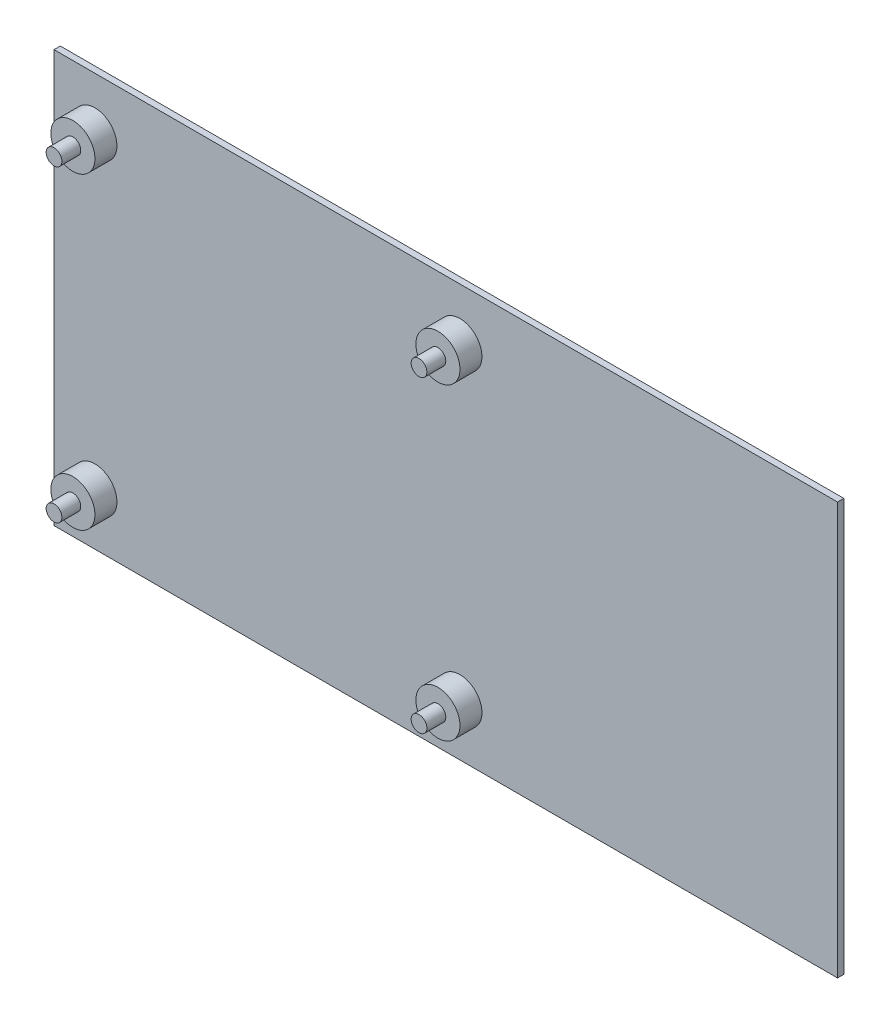
ISO-10303-21;
HEADER;
FILE_DESCRIPTION(('STEP AP214'),'2;1');
FILE_NAME('part.step','',(''),(''),'','','');
FILE_SCHEMA(('AUTOMOTIVE_DESIGN { 1 0 10303 214 1 1 1 1 }'));
ENDSEC;
DATA;
#1=APPLICATION_CONTEXT('core data for automotive mechanical design processes');
#2=APPLICATION_PROTOCOL_DEFINITION('international standard','automotive_design',2000,#1);
#3=PRODUCT_CONTEXT('',#1,'mechanical');
#4=PRODUCT('Part','Part','',(#3));
#5=PRODUCT_RELATED_PRODUCT_CATEGORY('part','',(#4));
#6=PRODUCT_DEFINITION_FORMATION('','',#4);
#7=PRODUCT_DEFINITION_CONTEXT('part definition',#1,'design');
#8=PRODUCT_DEFINITION('design','',#6,#7);
#9=PRODUCT_DEFINITION_SHAPE('','',#8);
#10=(LENGTH_UNIT() NAMED_UNIT(*) SI_UNIT(.MILLI.,.METRE.));
#11=(NAMED_UNIT(*) PLANE_ANGLE_UNIT() SI_UNIT($,.RADIAN.));
#12=(NAMED_UNIT(*) SI_UNIT($,.STERADIAN.) SOLID_ANGLE_UNIT());
#13=UNCERTAINTY_MEASURE_WITH_UNIT(LENGTH_MEASURE(1.E-05),#10,'distance_accuracy_value','');
#14=(GEOMETRIC_REPRESENTATION_CONTEXT(3) GLOBAL_UNCERTAINTY_ASSIGNED_CONTEXT((#13)) GLOBAL_UNIT_ASSIGNED_CONTEXT((#10,
#11,#12)) REPRESENTATION_CONTEXT('',''));
#15=CARTESIAN_POINT('',(0.,0.,0.));
#16=DIRECTION('',(0.,0.,1.));
#17=DIRECTION('',(1.,0.,0.));
#18=AXIS2_PLACEMENT_3D('',#15,#16,#17);
#19=CARTESIAN_POINT('',(-55.75,-24.5,4.5));
#20=DIRECTION('',(0.,0.,1.));
#21=DIRECTION('',(1.,0.,0.));
#22=AXIS2_PLACEMENT_3D('',#19,#20,#21);
#23=PLANE('',#22);
#24=CARTESIAN_POINT('',(-55.75,-24.5,4.5));
#25=DIRECTION('',(0.,0.,1.));
#26=DIRECTION('',(1.,0.,0.));
#27=AXIS2_PLACEMENT_3D('',#24,#25,#26);
#28=CIRCLE('',#27,3.5);
#29=CARTESIAN_POINT('',(-52.25,-24.5,4.5));
#30=VERTEX_POINT('',#29);
#31=EDGE_CURVE('E183',#30,#30,#28,.T.);
#32=ORIENTED_EDGE('',*,*,#31,.T.);
#33=EDGE_LOOP('',(#32));
#34=FACE_BOUND('',#33,.T.);
#35=CARTESIAN_POINT('',(-55.75,-24.5,4.5));
#36=DIRECTION('',(0.,0.,1.));
#37=DIRECTION('',(1.,0.,0.));
#38=AXIS2_PLACEMENT_3D('',#35,#36,#37);
#39=CIRCLE('',#38,1.25);
#40=CARTESIAN_POINT('',(-54.5,-24.5,4.5));
#41=VERTEX_POINT('',#40);
#42=EDGE_CURVE('E215',#41,#41,#39,.T.);
#43=ORIENTED_EDGE('',*,*,#42,.F.);
#44=EDGE_LOOP('',(#43));
#45=FACE_BOUND('',#44,.T.);
#46=ADVANCED_FACE('F32',(#34,#45),#23,.T.);
#47=CARTESIAN_POINT('',(2.25,-24.5,4.5));
#48=DIRECTION('',(0.,0.,1.));
#49=DIRECTION('',(1.,0.,0.));
#50=AXIS2_PLACEMENT_3D('',#47,#48,#49);
#51=PLANE('',#50);
#52=CARTESIAN_POINT('',(2.25,-24.5,4.5));
#53=DIRECTION('',(0.,0.,1.));
#54=DIRECTION('',(1.,0.,0.));
#55=AXIS2_PLACEMENT_3D('',#52,#53,#54);
#56=CIRCLE('',#55,3.5);
#57=CARTESIAN_POINT('',(5.75,-24.5,4.5));
#58=VERTEX_POINT('',#57);
#59=EDGE_CURVE('E191',#58,#58,#56,.T.);
#60=ORIENTED_EDGE('',*,*,#59,.T.);
#61=EDGE_LOOP('',(#60));
#62=FACE_BOUND('',#61,.T.);
#63=CARTESIAN_POINT('',(2.25,-24.5,4.5));
#64=DIRECTION('',(0.,0.,1.));
#65=DIRECTION('',(1.,0.,0.));
#66=AXIS2_PLACEMENT_3D('',#63,#64,#65);
#67=CIRCLE('',#66,1.25);
#68=CARTESIAN_POINT('',(3.5,-24.5,4.5));
#69=VERTEX_POINT('',#68);
#70=EDGE_CURVE('E209',#69,#69,#67,.T.);
#71=ORIENTED_EDGE('',*,*,#70,.F.);
#72=EDGE_LOOP('',(#71));
#73=FACE_BOUND('',#72,.T.);
#74=ADVANCED_FACE('F145',(#62,#73),#51,.T.);
#75=CARTESIAN_POINT('',(2.25,24.5,4.5));
#76=DIRECTION('',(0.,0.,1.));
#77=DIRECTION('',(1.,0.,0.));
#78=AXIS2_PLACEMENT_3D('',#75,#76,#77);
#79=PLANE('',#78);
#80=CARTESIAN_POINT('',(2.25,24.5,4.5));
#81=DIRECTION('',(0.,0.,1.));
#82=DIRECTION('',(1.,0.,0.));
#83=AXIS2_PLACEMENT_3D('',#80,#81,#82);
#84=CIRCLE('',#83,3.5);
#85=CARTESIAN_POINT('',(5.74999999999999,24.5,4.5));
#86=VERTEX_POINT('',#85);
#87=EDGE_CURVE('E194',#86,#86,#84,.T.);
#88=ORIENTED_EDGE('',*,*,#87,.T.);
#89=EDGE_LOOP('',(#88));
#90=FACE_BOUND('',#89,.T.);
#91=CARTESIAN_POINT('',(2.25,24.5,4.5));
#92=DIRECTION('',(0.,0.,1.));
#93=DIRECTION('',(1.,0.,0.));
#94=AXIS2_PLACEMENT_3D('',#91,#92,#93);
#95=CIRCLE('',#94,1.25);
#96=CARTESIAN_POINT('',(3.49999999999999,24.5,4.5));
#97=VERTEX_POINT('',#96);
#98=EDGE_CURVE('E186',#97,#97,#95,.T.);
#99=ORIENTED_EDGE('',*,*,#98,.F.);
#100=EDGE_LOOP('',(#99));
#101=FACE_BOUND('',#100,.T.);
#102=ADVANCED_FACE('F151',(#90,#101),#79,.T.);
#103=CARTESIAN_POINT('',(-55.75,24.5,4.5));
#104=DIRECTION('',(0.,0.,1.));
#105=DIRECTION('',(1.,0.,0.));
#106=AXIS2_PLACEMENT_3D('',#103,#104,#105);
#107=PLANE('',#106);
#108=CARTESIAN_POINT('',(-55.75,24.5,4.5));
#109=DIRECTION('',(0.,0.,1.));
#110=DIRECTION('',(1.,0.,0.));
#111=AXIS2_PLACEMENT_3D('',#108,#109,#110);
#112=CIRCLE('',#111,3.5);
#113=CARTESIAN_POINT('',(-52.25,24.5,4.5));
#114=VERTEX_POINT('',#113);
#115=EDGE_CURVE('E104',#114,#114,#112,.T.);
#116=ORIENTED_EDGE('',*,*,#115,.T.);
#117=EDGE_LOOP('',(#116));
#118=FACE_BOUND('',#117,.T.);
#119=CARTESIAN_POINT('',(-55.75,24.5,4.5));
#120=DIRECTION('',(0.,0.,1.));
#121=DIRECTION('',(1.,0.,0.));
#122=AXIS2_PLACEMENT_3D('',#119,#120,#121);
#123=CIRCLE('',#122,1.25);
#124=CARTESIAN_POINT('',(-54.5,24.5,4.5));
#125=VERTEX_POINT('',#124);
#126=EDGE_CURVE('E177',#125,#125,#123,.T.);
#127=ORIENTED_EDGE('',*,*,#126,.F.);
#128=EDGE_LOOP('',(#127));
#129=FACE_BOUND('',#128,.T.);
#130=ADVANCED_FACE('F123',(#118,#129),#107,.T.);
#131=CARTESIAN_POINT('',(0.,0.,1.));
#132=DIRECTION('',(0.,0.,-1.));
#133=DIRECTION('',(-1.,0.,0.));
#134=AXIS2_PLACEMENT_3D('',#131,#132,#133);
#135=PLANE('',#134);
#136=CARTESIAN_POINT('',(2.25,-24.5,1.));
#137=DIRECTION('',(0.,0.,-1.));
#138=DIRECTION('',(-1.,0.,0.));
#139=AXIS2_PLACEMENT_3D('',#136,#137,#138);
#140=CIRCLE('',#139,3.5);
#141=CARTESIAN_POINT('',(-1.25,-24.5,1.));
#142=VERTEX_POINT('',#141);
#143=EDGE_CURVE('E41',#142,#142,#140,.F.);
#144=ORIENTED_EDGE('',*,*,#143,.F.);
#145=EDGE_LOOP('',(#144));
#146=FACE_BOUND('',#145,.T.);
#147=CARTESIAN_POINT('',(-55.75,24.5,1.));
#148=DIRECTION('',(0.,0.,-1.));
#149=DIRECTION('',(-1.,0.,0.));
#150=AXIS2_PLACEMENT_3D('',#147,#148,#149);
#151=CIRCLE('',#150,3.5);
#152=CARTESIAN_POINT('',(-59.25,24.5,1.));
#153=VERTEX_POINT('',#152);
#154=EDGE_CURVE('E111',#153,#153,#151,.F.);
#155=ORIENTED_EDGE('',*,*,#154,.F.);
#156=EDGE_LOOP('',(#155));
#157=FACE_BOUND('',#156,.T.);
#158=DIRECTION('',(0.,-1.,0.));
#159=VECTOR('',#158,1.);
#160=CARTESIAN_POINT('',(-62.25,32.75,1.));
#161=LINE('',#160,#159);
#162=CARTESIAN_POINT('',(-62.25,32.75,1.));
#163=VERTEX_POINT('',#162);
#164=CARTESIAN_POINT('',(-62.25,-32.75,1.));
#165=VERTEX_POINT('',#164);
#166=EDGE_CURVE('E86',#163,#165,#161,.T.);
#167=ORIENTED_EDGE('',*,*,#166,.T.);
#168=DIRECTION('',(1.,0.,0.));
#169=VECTOR('',#168,1.);
#170=CARTESIAN_POINT('',(62.25,-32.75,1.));
#171=LINE('',#170,#169);
#172=CARTESIAN_POINT('',(62.25,-32.75,1.));
#173=VERTEX_POINT('',#172);
#174=EDGE_CURVE('E80',#165,#173,#171,.T.);
#175=ORIENTED_EDGE('',*,*,#174,.T.);
#176=DIRECTION('',(0.,1.,0.));
#177=VECTOR('',#176,1.);
#178=CARTESIAN_POINT('',(62.25,32.75,1.));
#179=LINE('',#178,#177);
#180=CARTESIAN_POINT('',(62.25,32.75,1.));
#181=VERTEX_POINT('',#180);
#182=EDGE_CURVE('E84',#173,#181,#179,.T.);
#183=ORIENTED_EDGE('',*,*,#182,.T.);
#184=DIRECTION('',(-1.,0.,0.));
#185=VECTOR('',#184,1.);
#186=CARTESIAN_POINT('',(62.25,32.75,1.));
#187=LINE('',#186,#185);
#188=EDGE_CURVE('E49',#181,#163,#187,.T.);
#189=ORIENTED_EDGE('',*,*,#188,.T.);
#190=EDGE_LOOP('',(#167,#175,#183,#189));
#191=FACE_BOUND('',#190,.T.);
#192=CARTESIAN_POINT('',(2.25,24.5,1.));
#193=DIRECTION('',(0.,0.,-1.));
#194=DIRECTION('',(-1.,0.,0.));
#195=AXIS2_PLACEMENT_3D('',#192,#193,#194);
#196=CIRCLE('',#195,3.5);
#197=CARTESIAN_POINT('',(-1.25,24.5,1.));
#198=VERTEX_POINT('',#197);
#199=EDGE_CURVE('E114',#198,#198,#196,.F.);
#200=ORIENTED_EDGE('',*,*,#199,.F.);
#201=EDGE_LOOP('',(#200));
#202=FACE_BOUND('',#201,.T.);
#203=CARTESIAN_POINT('',(-55.75,-24.5,1.));
#204=DIRECTION('',(0.,0.,-1.));
#205=DIRECTION('',(-1.,0.,0.));
#206=AXIS2_PLACEMENT_3D('',#203,#204,#205);
#207=CIRCLE('',#206,3.5);
#208=CARTESIAN_POINT('',(-59.25,-24.5,1.));
#209=VERTEX_POINT('',#208);
#210=EDGE_CURVE('E11',#209,#209,#207,.F.);
#211=ORIENTED_EDGE('',*,*,#210,.F.);
#212=EDGE_LOOP('',(#211));
#213=FACE_BOUND('',#212,.T.);
#214=ADVANCED_FACE('F81',(#146,#157,#191,#202,#213),#135,.F.);
#215=CARTESIAN_POINT('',(-62.25,32.75,1.));
#216=DIRECTION('',(1.,0.,0.));
#217=DIRECTION('',(0.,1.,0.));
#218=AXIS2_PLACEMENT_3D('',#215,#216,#217);
#219=PLANE('',#218);
#220=DIRECTION('',(0.,-1.,0.));
#221=VECTOR('',#220,1.);
#222=CARTESIAN_POINT('',(-62.25,32.75,0.));
#223=LINE('',#222,#221);
#224=CARTESIAN_POINT('',(-62.25,32.75,0.));
#225=VERTEX_POINT('',#224);
#226=CARTESIAN_POINT('',(-62.25,-32.75,0.));
#227=VERTEX_POINT('',#226);
#228=EDGE_CURVE('E101',#225,#227,#223,.T.);
#229=ORIENTED_EDGE('',*,*,#228,.T.);
#230=DIRECTION('',(0.,0.,-1.));
#231=VECTOR('',#230,1.);
#232=CARTESIAN_POINT('',(-62.25,-32.75,1.));
#233=LINE('',#232,#231);
#234=EDGE_CURVE('E92',#165,#227,#233,.T.);
#235=ORIENTED_EDGE('',*,*,#234,.F.);
#236=ORIENTED_EDGE('',*,*,#166,.F.);
#237=DIRECTION('',(0.,0.,-1.));
#238=VECTOR('',#237,1.);
#239=CARTESIAN_POINT('',(-62.25,32.75,1.));
#240=LINE('',#239,#238);
#241=EDGE_CURVE('E97',#163,#225,#240,.T.);
#242=ORIENTED_EDGE('',*,*,#241,.T.);
#243=EDGE_LOOP('',(#229,#235,#236,#242));
#244=FACE_BOUND('',#243,.T.);
#245=ADVANCED_FACE('F34',(#244),#219,.F.);
#246=CARTESIAN_POINT('',(62.25,-32.75,1.));
#247=DIRECTION('',(0.,1.,0.));
#248=DIRECTION('',(-1.,0.,0.));
#249=AXIS2_PLACEMENT_3D('',#246,#247,#248);
#250=PLANE('',#249);
#251=DIRECTION('',(1.,0.,0.));
#252=VECTOR('',#251,1.);
#253=CARTESIAN_POINT('',(62.25,-32.75,0.));
#254=LINE('',#253,#252);
#255=CARTESIAN_POINT('',(62.25,-32.75,0.));
#256=VERTEX_POINT('',#255);
#257=EDGE_CURVE('E91',#227,#256,#254,.T.);
#258=ORIENTED_EDGE('',*,*,#257,.T.);
#259=DIRECTION('',(0.,0.,-1.));
#260=VECTOR('',#259,1.);
#261=CARTESIAN_POINT('',(62.25,-32.75,1.));
#262=LINE('',#261,#260);
#263=EDGE_CURVE('E89',#173,#256,#262,.T.);
#264=ORIENTED_EDGE('',*,*,#263,.F.);
#265=ORIENTED_EDGE('',*,*,#174,.F.);
#266=ORIENTED_EDGE('',*,*,#234,.T.);
#267=EDGE_LOOP('',(#258,#264,#265,#266));
#268=FACE_BOUND('',#267,.T.);
#269=ADVANCED_FACE('F90',(#268),#250,.F.);
#270=CARTESIAN_POINT('',(62.25,32.75,1.));
#271=DIRECTION('',(-1.,0.,0.));
#272=DIRECTION('',(0.,-1.,0.));
#273=AXIS2_PLACEMENT_3D('',#270,#271,#272);
#274=PLANE('',#273);
#275=DIRECTION('',(0.,1.,0.));
#276=VECTOR('',#275,1.);
#277=CARTESIAN_POINT('',(62.25,32.75,0.));
#278=LINE('',#277,#276);
#279=CARTESIAN_POINT('',(62.25,32.75,0.));
#280=VERTEX_POINT('',#279);
#281=EDGE_CURVE('E66',#256,#280,#278,.T.);
#282=ORIENTED_EDGE('',*,*,#281,.T.);
#283=DIRECTION('',(0.,0.,-1.));
#284=VECTOR('',#283,1.);
#285=CARTESIAN_POINT('',(62.25,32.75,1.));
#286=LINE('',#285,#284);
#287=EDGE_CURVE('E93',#181,#280,#286,.T.);
#288=ORIENTED_EDGE('',*,*,#287,.F.);
#289=ORIENTED_EDGE('',*,*,#182,.F.);
#290=ORIENTED_EDGE('',*,*,#263,.T.);
#291=EDGE_LOOP('',(#282,#288,#289,#290));
#292=FACE_BOUND('',#291,.T.);
#293=ADVANCED_FACE('F95',(#292),#274,.F.);
#294=CARTESIAN_POINT('',(62.25,32.75,1.));
#295=DIRECTION('',(0.,-1.,0.));
#296=DIRECTION('',(1.,0.,0.));
#297=AXIS2_PLACEMENT_3D('',#294,#295,#296);
#298=PLANE('',#297);
#299=DIRECTION('',(-1.,0.,0.));
#300=VECTOR('',#299,1.);
#301=CARTESIAN_POINT('',(62.25,32.75,0.));
#302=LINE('',#301,#300);
#303=EDGE_CURVE('E72',#280,#225,#302,.T.);
#304=ORIENTED_EDGE('',*,*,#303,.T.);
#305=ORIENTED_EDGE('',*,*,#241,.F.);
#306=ORIENTED_EDGE('',*,*,#188,.F.);
#307=ORIENTED_EDGE('',*,*,#287,.T.);
#308=EDGE_LOOP('',(#304,#305,#306,#307));
#309=FACE_BOUND('',#308,.T.);
#310=ADVANCED_FACE('F139',(#309),#298,.F.);
#311=CARTESIAN_POINT('',(0.,0.,0.));
#312=DIRECTION('',(0.,0.,-1.));
#313=DIRECTION('',(-1.,0.,0.));
#314=AXIS2_PLACEMENT_3D('',#311,#312,#313);
#315=PLANE('',#314);
#316=ORIENTED_EDGE('',*,*,#228,.F.);
#317=ORIENTED_EDGE('',*,*,#303,.F.);
#318=ORIENTED_EDGE('',*,*,#281,.F.);
#319=ORIENTED_EDGE('',*,*,#257,.F.);
#320=EDGE_LOOP('',(#316,#317,#318,#319));
#321=FACE_BOUND('',#320,.T.);
#322=ADVANCED_FACE('F130',(#321),#315,.T.);
#323=CARTESIAN_POINT('',(-55.75,24.5,4.5));
#324=DIRECTION('',(0.,0.,-1.));
#325=DIRECTION('',(-1.,0.,0.));
#326=AXIS2_PLACEMENT_3D('',#323,#324,#325);
#327=CYLINDRICAL_SURFACE('',#326,3.5);
#328=ORIENTED_EDGE('',*,*,#115,.F.);
#329=EDGE_LOOP('',(#328));
#330=FACE_BOUND('',#329,.T.);
#331=ORIENTED_EDGE('',*,*,#154,.T.);
#332=EDGE_LOOP('',(#331));
#333=FACE_BOUND('',#332,.T.);
#334=ADVANCED_FACE('F127',(#330,#333),#327,.T.);
#335=CARTESIAN_POINT('',(2.25,24.5,4.5));
#336=DIRECTION('',(0.,0.,-1.));
#337=DIRECTION('',(-1.,0.,0.));
#338=AXIS2_PLACEMENT_3D('',#335,#336,#337);
#339=CYLINDRICAL_SURFACE('',#338,3.5);
#340=ORIENTED_EDGE('',*,*,#87,.F.);
#341=EDGE_LOOP('',(#340));
#342=FACE_BOUND('',#341,.T.);
#343=ORIENTED_EDGE('',*,*,#199,.T.);
#344=EDGE_LOOP('',(#343));
#345=FACE_BOUND('',#344,.T.);
#346=ADVANCED_FACE('F129',(#342,#345),#339,.T.);
#347=CARTESIAN_POINT('',(2.25,-24.5,4.5));
#348=DIRECTION('',(0.,0.,-1.));
#349=DIRECTION('',(-1.,0.,0.));
#350=AXIS2_PLACEMENT_3D('',#347,#348,#349);
#351=CYLINDRICAL_SURFACE('',#350,3.5);
#352=ORIENTED_EDGE('',*,*,#59,.F.);
#353=EDGE_LOOP('',(#352));
#354=FACE_BOUND('',#353,.T.);
#355=ORIENTED_EDGE('',*,*,#143,.T.);
#356=EDGE_LOOP('',(#355));
#357=FACE_BOUND('',#356,.T.);
#358=ADVANCED_FACE('F119',(#354,#357),#351,.T.);
#359=CARTESIAN_POINT('',(-55.75,-24.5,4.5));
#360=DIRECTION('',(0.,0.,-1.));
#361=DIRECTION('',(-1.,0.,0.));
#362=AXIS2_PLACEMENT_3D('',#359,#360,#361);
#363=CYLINDRICAL_SURFACE('',#362,3.5);
#364=ORIENTED_EDGE('',*,*,#31,.F.);
#365=EDGE_LOOP('',(#364));
#366=FACE_BOUND('',#365,.T.);
#367=ORIENTED_EDGE('',*,*,#210,.T.);
#368=EDGE_LOOP('',(#367));
#369=FACE_BOUND('',#368,.T.);
#370=ADVANCED_FACE('F160',(#366,#369),#363,.T.);
#371=CARTESIAN_POINT('',(-55.75,24.5,7.5));
#372=DIRECTION('',(0.,0.,-1.));
#373=DIRECTION('',(-1.,0.,0.));
#374=AXIS2_PLACEMENT_3D('',#371,#372,#373);
#375=CYLINDRICAL_SURFACE('',#374,1.25);
#376=CARTESIAN_POINT('',(-55.75,24.5,7.5));
#377=DIRECTION('',(0.,0.,1.));
#378=DIRECTION('',(1.,0.,0.));
#379=AXIS2_PLACEMENT_3D('',#376,#377,#378);
#380=CIRCLE('',#379,1.25);
#381=CARTESIAN_POINT('',(-54.5,24.5,7.5));
#382=VERTEX_POINT('',#381);
#383=EDGE_CURVE('E179',#382,#382,#380,.T.);
#384=ORIENTED_EDGE('',*,*,#383,.F.);
#385=EDGE_LOOP('',(#384));
#386=FACE_BOUND('',#385,.T.);
#387=ORIENTED_EDGE('',*,*,#126,.T.);
#388=EDGE_LOOP('',(#387));
#389=FACE_BOUND('',#388,.T.);
#390=ADVANCED_FACE('F158',(#386,#389),#375,.T.);
#391=CARTESIAN_POINT('',(-55.75,24.5,7.5));
#392=DIRECTION('',(0.,0.,1.));
#393=DIRECTION('',(1.,0.,0.));
#394=AXIS2_PLACEMENT_3D('',#391,#392,#393);
#395=PLANE('',#394);
#396=ORIENTED_EDGE('',*,*,#383,.T.);
#397=EDGE_LOOP('',(#396));
#398=FACE_BOUND('',#397,.T.);
#399=ADVANCED_FACE('F247',(#398),#395,.T.);
#400=CARTESIAN_POINT('',(2.25,24.5,7.5));
#401=DIRECTION('',(0.,0.,-1.));
#402=DIRECTION('',(-1.,0.,0.));
#403=AXIS2_PLACEMENT_3D('',#400,#401,#402);
#404=CYLINDRICAL_SURFACE('',#403,1.25);
#405=CARTESIAN_POINT('',(2.25,24.5,7.5));
#406=DIRECTION('',(0.,0.,1.));
#407=DIRECTION('',(1.,0.,0.));
#408=AXIS2_PLACEMENT_3D('',#405,#406,#407);
#409=CIRCLE('',#408,1.25);
#410=CARTESIAN_POINT('',(3.49999999999999,24.5,7.5));
#411=VERTEX_POINT('',#410);
#412=EDGE_CURVE('E180',#411,#411,#409,.T.);
#413=ORIENTED_EDGE('',*,*,#412,.F.);
#414=EDGE_LOOP('',(#413));
#415=FACE_BOUND('',#414,.T.);
#416=ORIENTED_EDGE('',*,*,#98,.T.);
#417=EDGE_LOOP('',(#416));
#418=FACE_BOUND('',#417,.T.);
#419=ADVANCED_FACE('F244',(#415,#418),#404,.T.);
#420=CARTESIAN_POINT('',(2.25,24.5,7.5));
#421=DIRECTION('',(0.,0.,1.));
#422=DIRECTION('',(1.,0.,0.));
#423=AXIS2_PLACEMENT_3D('',#420,#421,#422);
#424=PLANE('',#423);
#425=ORIENTED_EDGE('',*,*,#412,.T.);
#426=EDGE_LOOP('',(#425));
#427=FACE_BOUND('',#426,.T.);
#428=ADVANCED_FACE('F240',(#427),#424,.T.);
#429=CARTESIAN_POINT('',(2.25,-24.5,7.5));
#430=DIRECTION('',(0.,0.,-1.));
#431=DIRECTION('',(-1.,0.,0.));
#432=AXIS2_PLACEMENT_3D('',#429,#430,#431);
#433=CYLINDRICAL_SURFACE('',#432,1.25);
#434=CARTESIAN_POINT('',(2.25,-24.5,7.5));
#435=DIRECTION('',(0.,0.,1.));
#436=DIRECTION('',(1.,0.,0.));
#437=AXIS2_PLACEMENT_3D('',#434,#435,#436);
#438=CIRCLE('',#437,1.25);
#439=CARTESIAN_POINT('',(3.5,-24.5,7.5));
#440=VERTEX_POINT('',#439);
#441=EDGE_CURVE('E207',#440,#440,#438,.T.);
#442=ORIENTED_EDGE('',*,*,#441,.F.);
#443=EDGE_LOOP('',(#442));
#444=FACE_BOUND('',#443,.T.);
#445=ORIENTED_EDGE('',*,*,#70,.T.);
#446=EDGE_LOOP('',(#445));
#447=FACE_BOUND('',#446,.T.);
#448=ADVANCED_FACE('F234',(#444,#447),#433,.T.);
#449=CARTESIAN_POINT('',(2.25,-24.5,7.5));
#450=DIRECTION('',(0.,0.,1.));
#451=DIRECTION('',(1.,0.,0.));
#452=AXIS2_PLACEMENT_3D('',#449,#450,#451);
#453=PLANE('',#452);
#454=ORIENTED_EDGE('',*,*,#441,.T.);
#455=EDGE_LOOP('',(#454));
#456=FACE_BOUND('',#455,.T.);
#457=ADVANCED_FACE('F226',(#456),#453,.T.);
#458=CARTESIAN_POINT('',(-55.75,-24.5,7.5));
#459=DIRECTION('',(0.,0.,-1.));
#460=DIRECTION('',(-1.,0.,0.));
#461=AXIS2_PLACEMENT_3D('',#458,#459,#460);
#462=CYLINDRICAL_SURFACE('',#461,1.25);
#463=CARTESIAN_POINT('',(-55.75,-24.5,7.5));
#464=DIRECTION('',(0.,0.,1.));
#465=DIRECTION('',(1.,0.,0.));
#466=AXIS2_PLACEMENT_3D('',#463,#464,#465);
#467=CIRCLE('',#466,1.25);
#468=CARTESIAN_POINT('',(-54.5,-24.5,7.5));
#469=VERTEX_POINT('',#468);
#470=EDGE_CURVE('E213',#469,#469,#467,.T.);
#471=ORIENTED_EDGE('',*,*,#470,.F.);
#472=EDGE_LOOP('',(#471));
#473=FACE_BOUND('',#472,.T.);
#474=ORIENTED_EDGE('',*,*,#42,.T.);
#475=EDGE_LOOP('',(#474));
#476=FACE_BOUND('',#475,.T.);
#477=ADVANCED_FACE('F223',(#473,#476),#462,.T.);
#478=CARTESIAN_POINT('',(-55.75,-24.5,7.5));
#479=DIRECTION('',(0.,0.,1.));
#480=DIRECTION('',(1.,0.,0.));
#481=AXIS2_PLACEMENT_3D('',#478,#479,#480);
#482=PLANE('',#481);
#483=ORIENTED_EDGE('',*,*,#470,.T.);
#484=EDGE_LOOP('',(#483));
#485=FACE_BOUND('',#484,.T.);
#486=ADVANCED_FACE('F221',(#485),#482,.T.);
#487=CLOSED_SHELL('',(#46,#74,#102,#130,#214,#245,#269,#293,#310,#322,#334,#346,#358,#370,#390,
#399,#419,#428,#448,#457,#477,#486));
#488=MANIFOLD_SOLID_BREP('B2',#487);
#489=ADVANCED_BREP_SHAPE_REPRESENTATION('',(#18,#488),#14);
#490=SHAPE_DEFINITION_REPRESENTATION(#9,#489);
ENDSEC;
END-ISO-10303-21;
